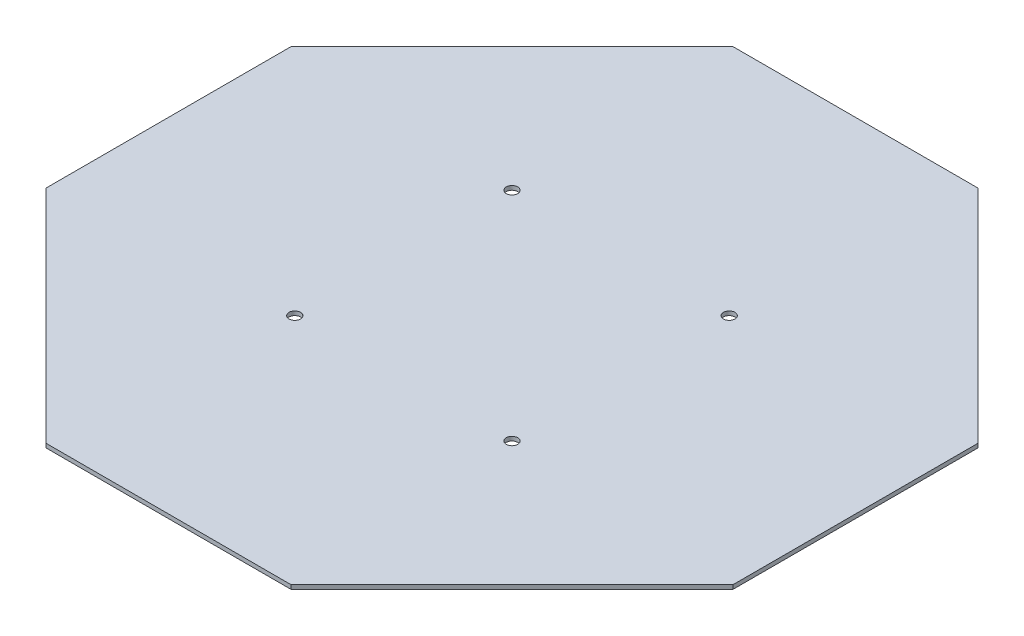
ISO-10303-21;
HEADER;
FILE_DESCRIPTION(('STEP AP214'),'2;1');
FILE_NAME('part.step','',(''),(''),'','','');
FILE_SCHEMA(('AUTOMOTIVE_DESIGN { 1 0 10303 214 1 1 1 1 }'));
ENDSEC;
DATA;
#1=APPLICATION_CONTEXT('core data for automotive mechanical design processes');
#2=APPLICATION_PROTOCOL_DEFINITION('international standard','automotive_design',2000,#1);
#3=PRODUCT_CONTEXT('',#1,'mechanical');
#4=PRODUCT('Part','Part','',(#3));
#5=PRODUCT_RELATED_PRODUCT_CATEGORY('part','',(#4));
#6=PRODUCT_DEFINITION_FORMATION('','',#4);
#7=PRODUCT_DEFINITION_CONTEXT('part definition',#1,'design');
#8=PRODUCT_DEFINITION('design','',#6,#7);
#9=PRODUCT_DEFINITION_SHAPE('','',#8);
#10=(LENGTH_UNIT() NAMED_UNIT(*) SI_UNIT(.MILLI.,.METRE.));
#11=(NAMED_UNIT(*) PLANE_ANGLE_UNIT() SI_UNIT($,.RADIAN.));
#12=(NAMED_UNIT(*) SI_UNIT($,.STERADIAN.) SOLID_ANGLE_UNIT());
#13=UNCERTAINTY_MEASURE_WITH_UNIT(LENGTH_MEASURE(1.E-05),#10,'distance_accuracy_value','');
#14=(GEOMETRIC_REPRESENTATION_CONTEXT(3) GLOBAL_UNCERTAINTY_ASSIGNED_CONTEXT((#13)) GLOBAL_UNIT_ASSIGNED_CONTEXT((#10,
#11,#12)) REPRESENTATION_CONTEXT('',''));
#15=CARTESIAN_POINT('',(0.,0.,0.));
#16=DIRECTION('',(0.,0.,1.));
#17=DIRECTION('',(1.,0.,0.));
#18=AXIS2_PLACEMENT_3D('',#15,#16,#17);
#19=CARTESIAN_POINT('',(-253.,3.,90.2426406871193));
#20=DIRECTION('',(1.,0.,0.));
#21=DIRECTION('',(0.,0.,-1.));
#22=AXIS2_PLACEMENT_3D('',#19,#20,#21);
#23=PLANE('',#22);
#24=DIRECTION('',(0.,0.,1.));
#25=VECTOR('',#24,1.);
#26=CARTESIAN_POINT('',(-253.,0.,90.2426406871193));
#27=LINE('',#26,#25);
#28=CARTESIAN_POINT('',(-253.,0.,-90.2426406871193));
#29=VERTEX_POINT('',#28);
#30=CARTESIAN_POINT('',(-253.,0.,90.2426406871193));
#31=VERTEX_POINT('',#30);
#32=EDGE_CURVE('E133',#29,#31,#27,.T.);
#33=ORIENTED_EDGE('',*,*,#32,.T.);
#34=DIRECTION('',(0.,-1.,0.));
#35=VECTOR('',#34,1.);
#36=CARTESIAN_POINT('',(-253.,3.,90.2426406871193));
#37=LINE('',#36,#35);
#38=CARTESIAN_POINT('',(-253.,3.,90.2426406871193));
#39=VERTEX_POINT('',#38);
#40=EDGE_CURVE('E11',#39,#31,#37,.T.);
#41=ORIENTED_EDGE('',*,*,#40,.F.);
#42=DIRECTION('',(0.,0.,1.));
#43=VECTOR('',#42,1.);
#44=CARTESIAN_POINT('',(-253.,3.,90.2426406871193));
#45=LINE('',#44,#43);
#46=CARTESIAN_POINT('',(-253.,3.,-90.2426406871193));
#47=VERTEX_POINT('',#46);
#48=EDGE_CURVE('E148',#47,#39,#45,.T.);
#49=ORIENTED_EDGE('',*,*,#48,.F.);
#50=DIRECTION('',(0.,-1.,0.));
#51=VECTOR('',#50,1.);
#52=CARTESIAN_POINT('',(-253.,3.,-90.2426406871193));
#53=LINE('',#52,#51);
#54=EDGE_CURVE('E129',#47,#29,#53,.T.);
#55=ORIENTED_EDGE('',*,*,#54,.T.);
#56=EDGE_LOOP('',(#33,#41,#49,#55));
#57=FACE_BOUND('',#56,.T.);
#58=ADVANCED_FACE('F37',(#57),#23,.F.);
#59=CARTESIAN_POINT('',(-90.2426406871192,3.,253.));
#60=DIRECTION('',(0.707106781186547,0.,-0.707106781186547));
#61=DIRECTION('',(-0.707106781186548,0.,-0.707106781186548));
#62=AXIS2_PLACEMENT_3D('',#59,#60,#61);
#63=PLANE('',#62);
#64=DIRECTION('',(0.707106781186548,0.,0.707106781186548));
#65=VECTOR('',#64,1.);
#66=CARTESIAN_POINT('',(-90.2426406871192,0.,253.));
#67=LINE('',#66,#65);
#68=CARTESIAN_POINT('',(-90.2426406871192,0.,253.));
#69=VERTEX_POINT('',#68);
#70=EDGE_CURVE('E136',#31,#69,#67,.T.);
#71=ORIENTED_EDGE('',*,*,#70,.T.);
#72=DIRECTION('',(0.,-1.,0.));
#73=VECTOR('',#72,1.);
#74=CARTESIAN_POINT('',(-90.2426406871192,3.,253.));
#75=LINE('',#74,#73);
#76=CARTESIAN_POINT('',(-90.2426406871192,3.,253.));
#77=VERTEX_POINT('',#76);
#78=EDGE_CURVE('E45',#77,#69,#75,.T.);
#79=ORIENTED_EDGE('',*,*,#78,.F.);
#80=DIRECTION('',(0.707106781186548,0.,0.707106781186548));
#81=VECTOR('',#80,1.);
#82=CARTESIAN_POINT('',(-90.2426406871192,3.,253.));
#83=LINE('',#82,#81);
#84=EDGE_CURVE('E96',#39,#77,#83,.T.);
#85=ORIENTED_EDGE('',*,*,#84,.F.);
#86=ORIENTED_EDGE('',*,*,#40,.T.);
#87=EDGE_LOOP('',(#71,#79,#85,#86));
#88=FACE_BOUND('',#87,.T.);
#89=ADVANCED_FACE('F231',(#88),#63,.F.);
#90=CARTESIAN_POINT('',(90.2426406871192,3.,253.));
#91=DIRECTION('',(0.,0.,-1.));
#92=DIRECTION('',(-1.,0.,0.));
#93=AXIS2_PLACEMENT_3D('',#90,#91,#92);
#94=PLANE('',#93);
#95=DIRECTION('',(1.,0.,0.));
#96=VECTOR('',#95,1.);
#97=CARTESIAN_POINT('',(90.2426406871192,0.,253.));
#98=LINE('',#97,#96);
#99=CARTESIAN_POINT('',(90.2426406871192,0.,253.));
#100=VERTEX_POINT('',#99);
#101=EDGE_CURVE('E139',#69,#100,#98,.T.);
#102=ORIENTED_EDGE('',*,*,#101,.T.);
#103=DIRECTION('',(0.,-1.,0.));
#104=VECTOR('',#103,1.);
#105=CARTESIAN_POINT('',(90.2426406871192,3.,253.));
#106=LINE('',#105,#104);
#107=CARTESIAN_POINT('',(90.2426406871192,3.,253.));
#108=VERTEX_POINT('',#107);
#109=EDGE_CURVE('E155',#108,#100,#106,.T.);
#110=ORIENTED_EDGE('',*,*,#109,.F.);
#111=DIRECTION('',(1.,0.,0.));
#112=VECTOR('',#111,1.);
#113=CARTESIAN_POINT('',(90.2426406871192,3.,253.));
#114=LINE('',#113,#112);
#115=EDGE_CURVE('E163',#77,#108,#114,.T.);
#116=ORIENTED_EDGE('',*,*,#115,.F.);
#117=ORIENTED_EDGE('',*,*,#78,.T.);
#118=EDGE_LOOP('',(#102,#110,#116,#117));
#119=FACE_BOUND('',#118,.T.);
#120=ADVANCED_FACE('F161',(#119),#94,.F.);
#121=CARTESIAN_POINT('',(253.,3.,90.2426406871193));
#122=DIRECTION('',(-0.707106781186547,0.,-0.707106781186547));
#123=DIRECTION('',(-0.707106781186548,0.,0.707106781186548));
#124=AXIS2_PLACEMENT_3D('',#121,#122,#123);
#125=PLANE('',#124);
#126=DIRECTION('',(0.707106781186548,0.,-0.707106781186548));
#127=VECTOR('',#126,1.);
#128=CARTESIAN_POINT('',(253.,0.,90.2426406871193));
#129=LINE('',#128,#127);
#130=CARTESIAN_POINT('',(253.,0.,90.2426406871193));
#131=VERTEX_POINT('',#130);
#132=EDGE_CURVE('E141',#100,#131,#129,.T.);
#133=ORIENTED_EDGE('',*,*,#132,.T.);
#134=DIRECTION('',(0.,-1.,0.));
#135=VECTOR('',#134,1.);
#136=CARTESIAN_POINT('',(253.,3.,90.2426406871193));
#137=LINE('',#136,#135);
#138=CARTESIAN_POINT('',(253.,3.,90.2426406871193));
#139=VERTEX_POINT('',#138);
#140=EDGE_CURVE('E152',#139,#131,#137,.T.);
#141=ORIENTED_EDGE('',*,*,#140,.F.);
#142=DIRECTION('',(0.707106781186548,0.,-0.707106781186548));
#143=VECTOR('',#142,1.);
#144=CARTESIAN_POINT('',(253.,3.,90.2426406871193));
#145=LINE('',#144,#143);
#146=EDGE_CURVE('E175',#108,#139,#145,.T.);
#147=ORIENTED_EDGE('',*,*,#146,.F.);
#148=ORIENTED_EDGE('',*,*,#109,.T.);
#149=EDGE_LOOP('',(#133,#141,#147,#148));
#150=FACE_BOUND('',#149,.T.);
#151=ADVANCED_FACE('F171',(#150),#125,.F.);
#152=CARTESIAN_POINT('',(253.,3.,-90.2426406871194));
#153=DIRECTION('',(-1.,0.,0.));
#154=DIRECTION('',(0.,0.,1.));
#155=AXIS2_PLACEMENT_3D('',#152,#153,#154);
#156=PLANE('',#155);
#157=DIRECTION('',(0.,0.,-1.));
#158=VECTOR('',#157,1.);
#159=CARTESIAN_POINT('',(253.,0.,-90.2426406871194));
#160=LINE('',#159,#158);
#161=CARTESIAN_POINT('',(253.,0.,-90.2426406871194));
#162=VERTEX_POINT('',#161);
#163=EDGE_CURVE('E143',#131,#162,#160,.T.);
#164=ORIENTED_EDGE('',*,*,#163,.T.);
#165=DIRECTION('',(0.,-1.,0.));
#166=VECTOR('',#165,1.);
#167=CARTESIAN_POINT('',(253.,3.,-90.2426406871194));
#168=LINE('',#167,#166);
#169=CARTESIAN_POINT('',(253.,3.,-90.2426406871194));
#170=VERTEX_POINT('',#169);
#171=EDGE_CURVE('E124',#170,#162,#168,.T.);
#172=ORIENTED_EDGE('',*,*,#171,.F.);
#173=DIRECTION('',(0.,0.,-1.));
#174=VECTOR('',#173,1.);
#175=CARTESIAN_POINT('',(253.,3.,-90.2426406871194));
#176=LINE('',#175,#174);
#177=EDGE_CURVE('E115',#139,#170,#176,.T.);
#178=ORIENTED_EDGE('',*,*,#177,.F.);
#179=ORIENTED_EDGE('',*,*,#140,.T.);
#180=EDGE_LOOP('',(#164,#172,#178,#179));
#181=FACE_BOUND('',#180,.T.);
#182=ADVANCED_FACE('F174',(#181),#156,.F.);
#183=CARTESIAN_POINT('',(90.2426406871193,3.,-253.));
#184=DIRECTION('',(-0.707106781186547,0.,0.707106781186547));
#185=DIRECTION('',(0.707106781186548,0.,0.707106781186548));
#186=AXIS2_PLACEMENT_3D('',#183,#184,#185);
#187=PLANE('',#186);
#188=DIRECTION('',(-0.707106781186548,0.,-0.707106781186548));
#189=VECTOR('',#188,1.);
#190=CARTESIAN_POINT('',(90.2426406871193,0.,-253.));
#191=LINE('',#190,#189);
#192=CARTESIAN_POINT('',(90.2426406871193,0.,-253.));
#193=VERTEX_POINT('',#192);
#194=EDGE_CURVE('E123',#162,#193,#191,.T.);
#195=ORIENTED_EDGE('',*,*,#194,.T.);
#196=DIRECTION('',(0.,-1.,0.));
#197=VECTOR('',#196,1.);
#198=CARTESIAN_POINT('',(90.2426406871193,3.,-253.));
#199=LINE('',#198,#197);
#200=CARTESIAN_POINT('',(90.2426406871193,3.,-253.));
#201=VERTEX_POINT('',#200);
#202=EDGE_CURVE('E120',#201,#193,#199,.T.);
#203=ORIENTED_EDGE('',*,*,#202,.F.);
#204=DIRECTION('',(-0.707106781186548,0.,-0.707106781186548));
#205=VECTOR('',#204,1.);
#206=CARTESIAN_POINT('',(90.2426406871193,3.,-253.));
#207=LINE('',#206,#205);
#208=EDGE_CURVE('E109',#170,#201,#207,.T.);
#209=ORIENTED_EDGE('',*,*,#208,.F.);
#210=ORIENTED_EDGE('',*,*,#171,.T.);
#211=EDGE_LOOP('',(#195,#203,#209,#210));
#212=FACE_BOUND('',#211,.T.);
#213=ADVANCED_FACE('F121',(#212),#187,.F.);
#214=CARTESIAN_POINT('',(-90.2426406871192,3.,-253.));
#215=DIRECTION('',(0.,0.,1.));
#216=DIRECTION('',(1.,0.,0.));
#217=AXIS2_PLACEMENT_3D('',#214,#215,#216);
#218=PLANE('',#217);
#219=DIRECTION('',(-1.,0.,0.));
#220=VECTOR('',#219,1.);
#221=CARTESIAN_POINT('',(-90.2426406871192,0.,-253.));
#222=LINE('',#221,#220);
#223=CARTESIAN_POINT('',(-90.2426406871192,0.,-253.));
#224=VERTEX_POINT('',#223);
#225=EDGE_CURVE('E82',#193,#224,#222,.T.);
#226=ORIENTED_EDGE('',*,*,#225,.T.);
#227=DIRECTION('',(0.,-1.,0.));
#228=VECTOR('',#227,1.);
#229=CARTESIAN_POINT('',(-90.2426406871192,3.,-253.));
#230=LINE('',#229,#228);
#231=CARTESIAN_POINT('',(-90.2426406871192,3.,-253.));
#232=VERTEX_POINT('',#231);
#233=EDGE_CURVE('E125',#232,#224,#230,.T.);
#234=ORIENTED_EDGE('',*,*,#233,.F.);
#235=DIRECTION('',(-1.,0.,0.));
#236=VECTOR('',#235,1.);
#237=CARTESIAN_POINT('',(-90.2426406871192,3.,-253.));
#238=LINE('',#237,#236);
#239=EDGE_CURVE('E113',#201,#232,#238,.T.);
#240=ORIENTED_EDGE('',*,*,#239,.F.);
#241=ORIENTED_EDGE('',*,*,#202,.T.);
#242=EDGE_LOOP('',(#226,#234,#240,#241));
#243=FACE_BOUND('',#242,.T.);
#244=ADVANCED_FACE('F127',(#243),#218,.F.);
#245=CARTESIAN_POINT('',(-253.,3.,-90.2426406871193));
#246=DIRECTION('',(0.707106781186547,0.,0.707106781186547));
#247=DIRECTION('',(0.707106781186548,0.,-0.707106781186548));
#248=AXIS2_PLACEMENT_3D('',#245,#246,#247);
#249=PLANE('',#248);
#250=DIRECTION('',(-0.707106781186548,0.,0.707106781186548));
#251=VECTOR('',#250,1.);
#252=CARTESIAN_POINT('',(-253.,0.,-90.2426406871193));
#253=LINE('',#252,#251);
#254=EDGE_CURVE('E88',#224,#29,#253,.T.);
#255=ORIENTED_EDGE('',*,*,#254,.T.);
#256=ORIENTED_EDGE('',*,*,#54,.F.);
#257=DIRECTION('',(-0.707106781186548,0.,0.707106781186548));
#258=VECTOR('',#257,1.);
#259=CARTESIAN_POINT('',(-253.,3.,-90.2426406871193));
#260=LINE('',#259,#258);
#261=EDGE_CURVE('E53',#232,#47,#260,.T.);
#262=ORIENTED_EDGE('',*,*,#261,.F.);
#263=ORIENTED_EDGE('',*,*,#233,.T.);
#264=EDGE_LOOP('',(#255,#256,#262,#263));
#265=FACE_BOUND('',#264,.T.);
#266=ADVANCED_FACE('F209',(#265),#249,.F.);
#267=CARTESIAN_POINT('',(0.,3.,0.));
#268=DIRECTION('',(0.,-1.,0.));
#269=DIRECTION('',(0.,0.,-1.));
#270=AXIS2_PLACEMENT_3D('',#267,#268,#269);
#271=PLANE('',#270);
#272=CARTESIAN_POINT('',(-80.,3.,80.));
#273=DIRECTION('',(0.,1.,0.));
#274=DIRECTION('',(0.,0.,1.));
#275=AXIS2_PLACEMENT_3D('',#272,#273,#274);
#276=CIRCLE('',#275,4.25000000000001);
#277=CARTESIAN_POINT('',(-80.,3.,84.25));
#278=VERTEX_POINT('',#277);
#279=EDGE_CURVE('E190',#278,#278,#276,.T.);
#280=ORIENTED_EDGE('',*,*,#279,.F.);
#281=EDGE_LOOP('',(#280));
#282=FACE_BOUND('',#281,.T.);
#283=CARTESIAN_POINT('',(80.,3.,80.));
#284=DIRECTION('',(0.,1.,0.));
#285=DIRECTION('',(0.,0.,1.));
#286=AXIS2_PLACEMENT_3D('',#283,#284,#285);
#287=CIRCLE('',#286,4.25000000000001);
#288=CARTESIAN_POINT('',(80.,3.,84.25));
#289=VERTEX_POINT('',#288);
#290=EDGE_CURVE('E196',#289,#289,#287,.T.);
#291=ORIENTED_EDGE('',*,*,#290,.F.);
#292=EDGE_LOOP('',(#291));
#293=FACE_BOUND('',#292,.T.);
#294=CARTESIAN_POINT('',(80.,3.,-80.));
#295=DIRECTION('',(0.,1.,0.));
#296=DIRECTION('',(0.,0.,1.));
#297=AXIS2_PLACEMENT_3D('',#294,#295,#296);
#298=CIRCLE('',#297,4.25000000000001);
#299=CARTESIAN_POINT('',(80.,3.,-75.75));
#300=VERTEX_POINT('',#299);
#301=EDGE_CURVE('E184',#300,#300,#298,.T.);
#302=ORIENTED_EDGE('',*,*,#301,.F.);
#303=EDGE_LOOP('',(#302));
#304=FACE_BOUND('',#303,.T.);
#305=CARTESIAN_POINT('',(-80.,3.,-80.));
#306=DIRECTION('',(0.,1.,0.));
#307=DIRECTION('',(0.,0.,1.));
#308=AXIS2_PLACEMENT_3D('',#305,#306,#307);
#309=CIRCLE('',#308,4.25000000000001);
#310=CARTESIAN_POINT('',(-80.,3.,-75.75));
#311=VERTEX_POINT('',#310);
#312=EDGE_CURVE('E181',#311,#311,#309,.T.);
#313=ORIENTED_EDGE('',*,*,#312,.F.);
#314=EDGE_LOOP('',(#313));
#315=FACE_BOUND('',#314,.T.);
#316=ORIENTED_EDGE('',*,*,#48,.T.);
#317=ORIENTED_EDGE('',*,*,#84,.T.);
#318=ORIENTED_EDGE('',*,*,#115,.T.);
#319=ORIENTED_EDGE('',*,*,#146,.T.);
#320=ORIENTED_EDGE('',*,*,#177,.T.);
#321=ORIENTED_EDGE('',*,*,#208,.T.);
#322=ORIENTED_EDGE('',*,*,#239,.T.);
#323=ORIENTED_EDGE('',*,*,#261,.T.);
#324=EDGE_LOOP('',(#316,#317,#318,#319,#320,#321,#322,#323));
#325=FACE_BOUND('',#324,.T.);
#326=ADVANCED_FACE('F111',(#282,#293,#304,#315,#325),#271,.F.);
#327=CARTESIAN_POINT('',(0.,0.,0.));
#328=DIRECTION('',(0.,-1.,0.));
#329=DIRECTION('',(0.,0.,-1.));
#330=AXIS2_PLACEMENT_3D('',#327,#328,#329);
#331=PLANE('',#330);
#332=CARTESIAN_POINT('',(-80.,0.,80.));
#333=DIRECTION('',(0.,1.,0.));
#334=DIRECTION('',(0.,0.,1.));
#335=AXIS2_PLACEMENT_3D('',#332,#333,#334);
#336=CIRCLE('',#335,4.25000000000001);
#337=CARTESIAN_POINT('',(-80.,0.,84.25));
#338=VERTEX_POINT('',#337);
#339=EDGE_CURVE('E187',#338,#338,#336,.T.);
#340=ORIENTED_EDGE('',*,*,#339,.T.);
#341=EDGE_LOOP('',(#340));
#342=FACE_BOUND('',#341,.T.);
#343=CARTESIAN_POINT('',(80.,0.,80.));
#344=DIRECTION('',(0.,1.,0.));
#345=DIRECTION('',(0.,0.,1.));
#346=AXIS2_PLACEMENT_3D('',#343,#344,#345);
#347=CIRCLE('',#346,4.25000000000001);
#348=CARTESIAN_POINT('',(80.,0.,84.25));
#349=VERTEX_POINT('',#348);
#350=EDGE_CURVE('E193',#349,#349,#347,.T.);
#351=ORIENTED_EDGE('',*,*,#350,.T.);
#352=EDGE_LOOP('',(#351));
#353=FACE_BOUND('',#352,.T.);
#354=CARTESIAN_POINT('',(80.,0.,-80.));
#355=DIRECTION('',(0.,1.,0.));
#356=DIRECTION('',(0.,0.,1.));
#357=AXIS2_PLACEMENT_3D('',#354,#355,#356);
#358=CIRCLE('',#357,4.25000000000001);
#359=CARTESIAN_POINT('',(80.,0.,-75.75));
#360=VERTEX_POINT('',#359);
#361=EDGE_CURVE('E199',#360,#360,#358,.T.);
#362=ORIENTED_EDGE('',*,*,#361,.T.);
#363=EDGE_LOOP('',(#362));
#364=FACE_BOUND('',#363,.T.);
#365=CARTESIAN_POINT('',(-80.,0.,-80.));
#366=DIRECTION('',(0.,1.,0.));
#367=DIRECTION('',(0.,0.,1.));
#368=AXIS2_PLACEMENT_3D('',#365,#366,#367);
#369=CIRCLE('',#368,4.25000000000001);
#370=CARTESIAN_POINT('',(-80.,0.,-75.75));
#371=VERTEX_POINT('',#370);
#372=EDGE_CURVE('E137',#371,#371,#369,.T.);
#373=ORIENTED_EDGE('',*,*,#372,.T.);
#374=EDGE_LOOP('',(#373));
#375=FACE_BOUND('',#374,.T.);
#376=ORIENTED_EDGE('',*,*,#32,.F.);
#377=ORIENTED_EDGE('',*,*,#254,.F.);
#378=ORIENTED_EDGE('',*,*,#225,.F.);
#379=ORIENTED_EDGE('',*,*,#194,.F.);
#380=ORIENTED_EDGE('',*,*,#163,.F.);
#381=ORIENTED_EDGE('',*,*,#132,.F.);
#382=ORIENTED_EDGE('',*,*,#101,.F.);
#383=ORIENTED_EDGE('',*,*,#70,.F.);
#384=EDGE_LOOP('',(#376,#377,#378,#379,#380,#381,#382,#383));
#385=FACE_BOUND('',#384,.T.);
#386=ADVANCED_FACE('F167',(#342,#353,#364,#375,#385),#331,.T.);
#387=CARTESIAN_POINT('',(-80.,0.,-80.));
#388=DIRECTION('',(0.,1.,0.));
#389=DIRECTION('',(0.,0.,1.));
#390=AXIS2_PLACEMENT_3D('',#387,#388,#389);
#391=CYLINDRICAL_SURFACE('',#390,4.25000000000001);
#392=ORIENTED_EDGE('',*,*,#372,.F.);
#393=EDGE_LOOP('',(#392));
#394=FACE_BOUND('',#393,.T.);
#395=ORIENTED_EDGE('',*,*,#312,.T.);
#396=EDGE_LOOP('',(#395));
#397=FACE_BOUND('',#396,.T.);
#398=ADVANCED_FACE('F214',(#394,#397),#391,.F.);
#399=CARTESIAN_POINT('',(80.,0.,-80.));
#400=DIRECTION('',(0.,1.,0.));
#401=DIRECTION('',(0.,0.,1.));
#402=AXIS2_PLACEMENT_3D('',#399,#400,#401);
#403=CYLINDRICAL_SURFACE('',#402,4.25000000000001);
#404=ORIENTED_EDGE('',*,*,#361,.F.);
#405=EDGE_LOOP('',(#404));
#406=FACE_BOUND('',#405,.T.);
#407=ORIENTED_EDGE('',*,*,#301,.T.);
#408=EDGE_LOOP('',(#407));
#409=FACE_BOUND('',#408,.T.);
#410=ADVANCED_FACE('F205',(#406,#409),#403,.F.);
#411=CARTESIAN_POINT('',(80.,0.,80.));
#412=DIRECTION('',(0.,1.,0.));
#413=DIRECTION('',(0.,0.,1.));
#414=AXIS2_PLACEMENT_3D('',#411,#412,#413);
#415=CYLINDRICAL_SURFACE('',#414,4.25000000000001);
#416=ORIENTED_EDGE('',*,*,#350,.F.);
#417=EDGE_LOOP('',(#416));
#418=FACE_BOUND('',#417,.T.);
#419=ORIENTED_EDGE('',*,*,#290,.T.);
#420=EDGE_LOOP('',(#419));
#421=FACE_BOUND('',#420,.T.);
#422=ADVANCED_FACE('F222',(#418,#421),#415,.F.);
#423=CARTESIAN_POINT('',(-80.,0.,80.));
#424=DIRECTION('',(0.,1.,0.));
#425=DIRECTION('',(0.,0.,1.));
#426=AXIS2_PLACEMENT_3D('',#423,#424,#425);
#427=CYLINDRICAL_SURFACE('',#426,4.25000000000001);
#428=ORIENTED_EDGE('',*,*,#339,.F.);
#429=EDGE_LOOP('',(#428));
#430=FACE_BOUND('',#429,.T.);
#431=ORIENTED_EDGE('',*,*,#279,.T.);
#432=EDGE_LOOP('',(#431));
#433=FACE_BOUND('',#432,.T.);
#434=ADVANCED_FACE('F306',(#430,#433),#427,.F.);
#435=CLOSED_SHELL('',(#58,#89,#120,#151,#182,#213,#244,#266,#326,#386,#398,#410,#422,#434));
#436=MANIFOLD_SOLID_BREP('B2',#435);
#437=ADVANCED_BREP_SHAPE_REPRESENTATION('',(#18,#436),#14);
#438=SHAPE_DEFINITION_REPRESENTATION(#9,#437);
ENDSEC;
END-ISO-10303-21;
